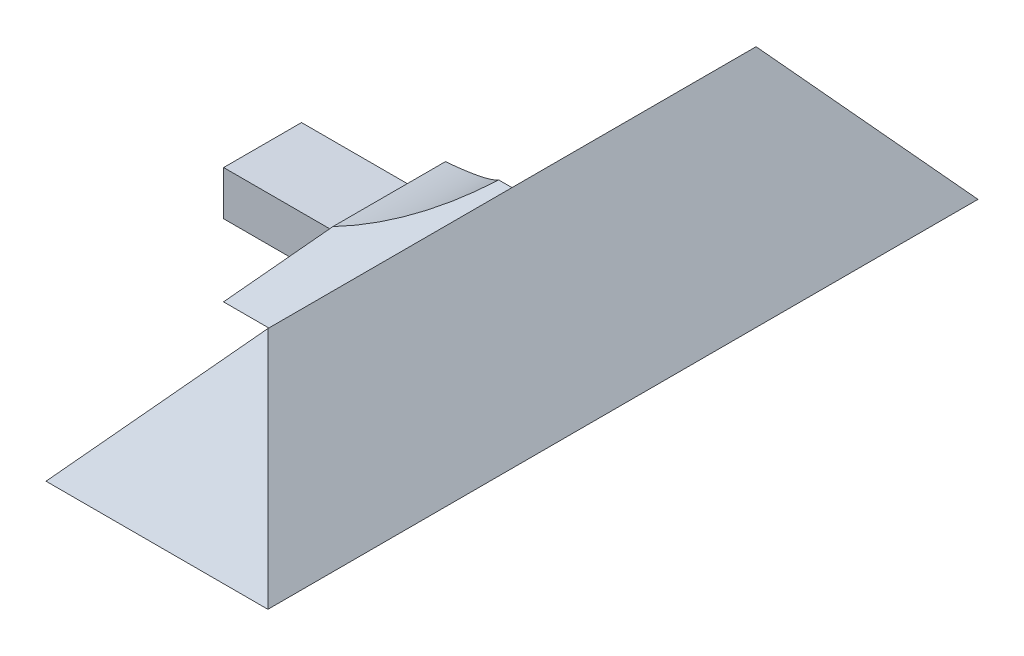
ISO-10303-21;
HEADER;
FILE_DESCRIPTION(('STEP AP214'),'2;1');
FILE_NAME('part.step','',(''),(''),'','','');
FILE_SCHEMA(('AUTOMOTIVE_DESIGN { 1 0 10303 214 1 1 1 1 }'));
ENDSEC;
DATA;
#1=APPLICATION_CONTEXT('core data for automotive mechanical design processes');
#2=APPLICATION_PROTOCOL_DEFINITION('international standard','automotive_design',2000,#1);
#3=PRODUCT_CONTEXT('',#1,'mechanical');
#4=PRODUCT('Part','Part','',(#3));
#5=PRODUCT_RELATED_PRODUCT_CATEGORY('part','',(#4));
#6=PRODUCT_DEFINITION_FORMATION('','',#4);
#7=PRODUCT_DEFINITION_CONTEXT('part definition',#1,'design');
#8=PRODUCT_DEFINITION('design','',#6,#7);
#9=PRODUCT_DEFINITION_SHAPE('','',#8);
#10=(LENGTH_UNIT() NAMED_UNIT(*) SI_UNIT(.MILLI.,.METRE.));
#11=(NAMED_UNIT(*) PLANE_ANGLE_UNIT() SI_UNIT($,.RADIAN.));
#12=(NAMED_UNIT(*) SI_UNIT($,.STERADIAN.) SOLID_ANGLE_UNIT());
#13=UNCERTAINTY_MEASURE_WITH_UNIT(LENGTH_MEASURE(1.E-05),#10,'distance_accuracy_value','');
#14=(GEOMETRIC_REPRESENTATION_CONTEXT(3) GLOBAL_UNCERTAINTY_ASSIGNED_CONTEXT((#13)) GLOBAL_UNIT_ASSIGNED_CONTEXT((#10,
#11,#12)) REPRESENTATION_CONTEXT('',''));
#15=CARTESIAN_POINT('',(0.,0.,0.));
#16=DIRECTION('',(0.,0.,1.));
#17=DIRECTION('',(1.,0.,0.));
#18=AXIS2_PLACEMENT_3D('',#15,#16,#17);
#19=CARTESIAN_POINT('',(0.,0.,0.));
#20=DIRECTION('',(-0.766044443118977,0.64278760968654,0.));
#21=DIRECTION('',(-0.64278760968654,-0.766044443118977,0.));
#22=AXIS2_PLACEMENT_3D('',#19,#20,#21);
#23=PLANE('',#22);
#24=DIRECTION('',(-0.540716203060937,-0.644400477571771,0.540716203060937));
#25=VECTOR('',#24,1.);
#26=CARTESIAN_POINT('',(0.,0.,0.));
#27=LINE('',#26,#25);
#28=CARTESIAN_POINT('',(12.3209791555007,14.6835711728463,-12.3209791555007));
#29=VERTEX_POINT('',#28);
#30=CARTESIAN_POINT('',(0.,0.,0.));
#31=VERTEX_POINT('',#30);
#32=EDGE_CURVE('E137',#29,#31,#27,.T.);
#33=ORIENTED_EDGE('',*,*,#32,.F.);
#34=DIRECTION('',(0.,0.,1.));
#35=VECTOR('',#34,1.);
#36=CARTESIAN_POINT('',(12.3209791555007,14.6835711728463,-80.));
#37=LINE('',#36,#35);
#38=CARTESIAN_POINT('',(12.3209791555007,14.6835711728463,-37.6790208444993));
#39=VERTEX_POINT('',#38);
#40=EDGE_CURVE('E126',#29,#39,#37,.F.);
#41=ORIENTED_EDGE('',*,*,#40,.T.);
#42=DIRECTION('',(-0.540716203060937,-0.644400477571771,-0.540716203060937));
#43=VECTOR('',#42,1.);
#44=CARTESIAN_POINT('',(14.6187006126319,17.4218889741631,-35.3812993873682));
#45=LINE('',#44,#43);
#46=CARTESIAN_POINT('',(0.,0.,-50.));
#47=VERTEX_POINT('',#46);
#48=EDGE_CURVE('E134',#39,#47,#45,.T.);
#49=ORIENTED_EDGE('',*,*,#48,.T.);
#50=DIRECTION('',(0.,0.,1.));
#51=VECTOR('',#50,1.);
#52=CARTESIAN_POINT('',(0.,0.,0.));
#53=LINE('',#52,#51);
#54=CARTESIAN_POINT('',(0.,0.,-33.7752249690268));
#55=VERTEX_POINT('',#54);
#56=EDGE_CURVE('E208',#47,#55,#53,.T.);
#57=ORIENTED_EDGE('',*,*,#56,.T.);
#58=DIRECTION('',(-0.64278760968654,-0.766044443118977,0.));
#59=VECTOR('',#58,1.);
#60=CARTESIAN_POINT('',(0.,0.,-33.7752249690268));
#61=LINE('',#60,#59);
#62=CARTESIAN_POINT('',(8.39099631177282,10.,-33.7752249690268));
#63=VERTEX_POINT('',#62);
#64=EDGE_CURVE('E219',#55,#63,#61,.F.);
#65=ORIENTED_EDGE('',*,*,#64,.T.);
#66=DIRECTION('',(0.,0.,1.));
#67=VECTOR('',#66,1.);
#68=CARTESIAN_POINT('',(8.39099631177282,10.,0.));
#69=LINE('',#68,#67);
#70=CARTESIAN_POINT('',(8.39099631177282,10.,-16.2247750309732));
#71=VERTEX_POINT('',#70);
#72=EDGE_CURVE('E11',#71,#63,#69,.F.);
#73=ORIENTED_EDGE('',*,*,#72,.F.);
#74=DIRECTION('',(0.64278760968654,0.766044443118977,0.));
#75=VECTOR('',#74,1.);
#76=CARTESIAN_POINT('',(0.,0.,-16.2247750309732));
#77=LINE('',#76,#75);
#78=CARTESIAN_POINT('',(0.,0.,-16.2247750309732));
#79=VERTEX_POINT('',#78);
#80=EDGE_CURVE('E242',#71,#79,#77,.F.);
#81=ORIENTED_EDGE('',*,*,#80,.T.);
#82=EDGE_CURVE('E213',#79,#31,#53,.T.);
#83=ORIENTED_EDGE('',*,*,#82,.T.);
#84=EDGE_LOOP('',(#33,#41,#49,#57,#65,#73,#81,#83));
#85=FACE_BOUND('',#84,.T.);
#86=ADVANCED_FACE('F41',(#85),#23,.T.);
#87=CARTESIAN_POINT('',(0.,0.,0.));
#88=DIRECTION('',(0.,0.64278760968654,0.766044443118977));
#89=DIRECTION('',(0.,-0.766044443118977,0.64278760968654));
#90=AXIS2_PLACEMENT_3D('',#87,#88,#89);
#91=PLANE('',#90);
#92=DIRECTION('',(1.,0.,0.));
#93=VECTOR('',#92,1.);
#94=CARTESIAN_POINT('',(0.,29.7938398148552,-25.));
#95=LINE('',#94,#93);
#96=CARTESIAN_POINT('',(36.9995878774412,29.7938398148552,-25.));
#97=VERTEX_POINT('',#96);
#98=CARTESIAN_POINT('',(40.,29.7938398148552,-25.));
#99=VERTEX_POINT('',#98);
#100=EDGE_CURVE('E50',#97,#99,#95,.T.);
#101=ORIENTED_EDGE('',*,*,#100,.F.);
#102=CARTESIAN_POINT('',(-13.7673292794252,85.,-71.323468650069));
#103=DIRECTION('',(0.,0.64278760968654,0.766044443118977));
#104=DIRECTION('',(0.,-0.766044443118977,0.64278760968654));
#105=AXIS2_PLACEMENT_3D('',#102,#103,#104);
#106=ELLIPSE('',#105,97.905546699921,75.);
#107=EDGE_CURVE('E57',#97,#29,#106,.F.);
#108=ORIENTED_EDGE('',*,*,#107,.T.);
#109=ORIENTED_EDGE('',*,*,#32,.T.);
#110=DIRECTION('',(1.,0.,0.));
#111=VECTOR('',#110,1.);
#112=CARTESIAN_POINT('',(0.,0.,0.));
#113=LINE('',#112,#111);
#114=CARTESIAN_POINT('',(15.,0.,0.));
#115=VERTEX_POINT('',#114);
#116=EDGE_CURVE('E197',#31,#115,#113,.T.);
#117=ORIENTED_EDGE('',*,*,#116,.T.);
#118=DIRECTION('',(-0.540716203060937,-0.644400477571771,0.540716203060937));
#119=VECTOR('',#118,1.);
#120=CARTESIAN_POINT('',(10.6143898162105,-5.22656669224895,4.38561018378957));
#121=LINE('',#120,#119);
#122=EDGE_CURVE('E169',#99,#115,#121,.T.);
#123=ORIENTED_EDGE('',*,*,#122,.F.);
#124=EDGE_LOOP('',(#101,#108,#109,#117,#123));
#125=FACE_BOUND('',#124,.T.);
#126=ADVANCED_FACE('F43',(#125),#91,.T.);
#127=CARTESIAN_POINT('',(15.,0.,0.));
#128=DIRECTION('',(-0.766044443118977,0.64278760968654,0.));
#129=DIRECTION('',(-0.64278760968654,-0.766044443118977,0.));
#130=AXIS2_PLACEMENT_3D('',#127,#128,#129);
#131=PLANE('',#130);
#132=DIRECTION('',(-0.540716203060937,-0.644400477571771,0.540716203060937));
#133=VECTOR('',#132,1.);
#134=CARTESIAN_POINT('',(29.6187006126319,17.4218889741631,40.3812993873682));
#135=LINE('',#134,#133);
#136=CARTESIAN_POINT('',(40.,29.7938398148552,30.));
#137=VERTEX_POINT('',#136);
#138=CARTESIAN_POINT('',(15.,0.,55.));
#139=VERTEX_POINT('',#138);
#140=EDGE_CURVE('E166',#137,#139,#135,.T.);
#141=ORIENTED_EDGE('',*,*,#140,.F.);
#142=DIRECTION('',(0.,0.,-1.));
#143=VECTOR('',#142,1.);
#144=CARTESIAN_POINT('',(40.,29.7938398148552,0.));
#145=LINE('',#144,#143);
#146=EDGE_CURVE('E172',#137,#99,#145,.T.);
#147=ORIENTED_EDGE('',*,*,#146,.T.);
#148=ORIENTED_EDGE('',*,*,#122,.T.);
#149=DIRECTION('',(0.,0.,1.));
#150=VECTOR('',#149,1.);
#151=CARTESIAN_POINT('',(15.,0.,0.));
#152=LINE('',#151,#150);
#153=EDGE_CURVE('E217',#115,#139,#152,.T.);
#154=ORIENTED_EDGE('',*,*,#153,.T.);
#155=EDGE_LOOP('',(#141,#147,#148,#154));
#156=FACE_BOUND('',#155,.T.);
#157=ADVANCED_FACE('F192',(#156),#131,.T.);
#158=CARTESIAN_POINT('',(65.,0.,55.));
#159=DIRECTION('',(0.,0.64278760968654,0.766044443118977));
#160=DIRECTION('',(0.,-0.766044443118977,0.64278760968654));
#161=AXIS2_PLACEMENT_3D('',#158,#159,#160);
#162=PLANE('',#161);
#163=DIRECTION('',(1.,0.,0.));
#164=VECTOR('',#163,1.);
#165=CARTESIAN_POINT('',(65.,0.,55.));
#166=LINE('',#165,#164);
#167=CARTESIAN_POINT('',(65.,0.,55.));
#168=VERTEX_POINT('',#167);
#169=EDGE_CURVE('E225',#139,#168,#166,.T.);
#170=ORIENTED_EDGE('',*,*,#169,.T.);
#171=DIRECTION('',(0.540716203060938,-0.644400477571771,0.540716203060937));
#172=VECTOR('',#171,1.);
#173=CARTESIAN_POINT('',(18.2201580395781,55.750044717322,8.2201580395781));
#174=LINE('',#173,#172);
#175=EDGE_CURVE('E162',#137,#168,#174,.T.);
#176=ORIENTED_EDGE('',*,*,#175,.F.);
#177=ORIENTED_EDGE('',*,*,#140,.T.);
#178=EDGE_LOOP('',(#170,#176,#177));
#179=FACE_BOUND('',#178,.T.);
#180=ADVANCED_FACE('F237',(#179),#162,.T.);
#181=CARTESIAN_POINT('',(65.,0.,-105.));
#182=DIRECTION('',(0.766044443118977,0.64278760968654,0.));
#183=DIRECTION('',(-0.64278760968654,0.766044443118977,0.));
#184=AXIS2_PLACEMENT_3D('',#181,#182,#183);
#185=PLANE('',#184);
#186=DIRECTION('',(0.540716203060937,-0.644400477571771,-0.540716203060937));
#187=VECTOR('',#186,1.);
#188=CARTESIAN_POINT('',(65.,0.,-105.));
#189=LINE('',#188,#187);
#190=CARTESIAN_POINT('',(40.,29.7938398148552,-80.));
#191=VERTEX_POINT('',#190);
#192=CARTESIAN_POINT('',(65.,0.,-105.));
#193=VERTEX_POINT('',#192);
#194=EDGE_CURVE('E159',#191,#193,#189,.T.);
#195=ORIENTED_EDGE('',*,*,#194,.F.);
#196=DIRECTION('',(0.,0.,1.));
#197=VECTOR('',#196,1.);
#198=CARTESIAN_POINT('',(40.,29.7938398148552,-105.));
#199=LINE('',#198,#197);
#200=EDGE_CURVE('E176',#191,#99,#199,.T.);
#201=ORIENTED_EDGE('',*,*,#200,.T.);
#202=ORIENTED_EDGE('',*,*,#146,.F.);
#203=ORIENTED_EDGE('',*,*,#175,.T.);
#204=DIRECTION('',(0.,0.,-1.));
#205=VECTOR('',#204,1.);
#206=CARTESIAN_POINT('',(65.,0.,-105.));
#207=LINE('',#206,#205);
#208=EDGE_CURVE('E228',#168,#193,#207,.T.);
#209=ORIENTED_EDGE('',*,*,#208,.T.);
#210=EDGE_LOOP('',(#195,#201,#202,#203,#209));
#211=FACE_BOUND('',#210,.T.);
#212=ADVANCED_FACE('F186',(#211),#185,.T.);
#213=CARTESIAN_POINT('',(65.,0.,-105.));
#214=DIRECTION('',(0.,0.64278760968654,-0.766044443118977));
#215=DIRECTION('',(0.,0.766044443118977,0.64278760968654));
#216=AXIS2_PLACEMENT_3D('',#213,#214,#215);
#217=PLANE('',#216);
#218=DIRECTION('',(-1.,0.,0.));
#219=VECTOR('',#218,1.);
#220=CARTESIAN_POINT('',(65.,0.,-105.));
#221=LINE('',#220,#219);
#222=CARTESIAN_POINT('',(15.,0.,-105.));
#223=VERTEX_POINT('',#222);
#224=EDGE_CURVE('E204',#193,#223,#221,.T.);
#225=ORIENTED_EDGE('',*,*,#224,.T.);
#226=DIRECTION('',(-0.540716203060937,-0.644400477571771,-0.540716203060937));
#227=VECTOR('',#226,1.);
#228=CARTESIAN_POINT('',(15.,0.,-105.));
#229=LINE('',#228,#227);
#230=EDGE_CURVE('E150',#191,#223,#229,.T.);
#231=ORIENTED_EDGE('',*,*,#230,.F.);
#232=ORIENTED_EDGE('',*,*,#194,.T.);
#233=EDGE_LOOP('',(#225,#231,#232));
#234=FACE_BOUND('',#233,.T.);
#235=ADVANCED_FACE('F233',(#234),#217,.T.);
#236=CARTESIAN_POINT('',(15.,0.,-105.));
#237=DIRECTION('',(-0.766044443118977,0.64278760968654,0.));
#238=DIRECTION('',(-0.64278760968654,-0.766044443118977,0.));
#239=AXIS2_PLACEMENT_3D('',#236,#237,#238);
#240=PLANE('',#239);
#241=ORIENTED_EDGE('',*,*,#200,.F.);
#242=ORIENTED_EDGE('',*,*,#230,.T.);
#243=DIRECTION('',(0.,0.,1.));
#244=VECTOR('',#243,1.);
#245=CARTESIAN_POINT('',(15.,0.,-105.));
#246=LINE('',#245,#244);
#247=CARTESIAN_POINT('',(15.,0.,-50.));
#248=VERTEX_POINT('',#247);
#249=EDGE_CURVE('E152',#223,#248,#246,.T.);
#250=ORIENTED_EDGE('',*,*,#249,.T.);
#251=DIRECTION('',(-0.540716203060937,-0.644400477571771,-0.540716203060937));
#252=VECTOR('',#251,1.);
#253=CARTESIAN_POINT('',(-1.08057067389501,-19.1640778715794,-66.080570673895));
#254=LINE('',#253,#252);
#255=EDGE_CURVE('E146',#99,#248,#254,.T.);
#256=ORIENTED_EDGE('',*,*,#255,.F.);
#257=EDGE_LOOP('',(#241,#242,#250,#256));
#258=FACE_BOUND('',#257,.T.);
#259=ADVANCED_FACE('F199',(#258),#240,.T.);
#260=CARTESIAN_POINT('',(0.,0.,-50.));
#261=DIRECTION('',(0.,0.64278760968654,-0.766044443118977));
#262=DIRECTION('',(0.,0.766044443118977,0.64278760968654));
#263=AXIS2_PLACEMENT_3D('',#260,#261,#262);
#264=PLANE('',#263);
#265=ORIENTED_EDGE('',*,*,#48,.F.);
#266=CARTESIAN_POINT('',(-13.7673292794252,85.,21.323468650069));
#267=DIRECTION('',(0.,0.64278760968654,-0.766044443118977));
#268=DIRECTION('',(0.,0.766044443118977,0.64278760968654));
#269=AXIS2_PLACEMENT_3D('',#266,#267,#268);
#270=ELLIPSE('',#269,97.905546699921,75.);
#271=EDGE_CURVE('E123',#39,#97,#270,.F.);
#272=ORIENTED_EDGE('',*,*,#271,.T.);
#273=ORIENTED_EDGE('',*,*,#100,.T.);
#274=ORIENTED_EDGE('',*,*,#255,.T.);
#275=DIRECTION('',(-1.,0.,0.));
#276=VECTOR('',#275,1.);
#277=CARTESIAN_POINT('',(0.,0.,-50.));
#278=LINE('',#277,#276);
#279=EDGE_CURVE('E143',#248,#47,#278,.T.);
#280=ORIENTED_EDGE('',*,*,#279,.T.);
#281=EDGE_LOOP('',(#265,#272,#273,#274,#280));
#282=FACE_BOUND('',#281,.T.);
#283=ADVANCED_FACE('F141',(#282),#264,.T.);
#284=CARTESIAN_POINT('',(0.,0.,0.));
#285=DIRECTION('',(0.,-1.,0.));
#286=DIRECTION('',(0.,0.,-1.));
#287=AXIS2_PLACEMENT_3D('',#284,#285,#286);
#288=PLANE('',#287);
#289=ORIENTED_EDGE('',*,*,#82,.F.);
#290=DIRECTION('',(-1.,0.,0.));
#291=VECTOR('',#290,1.);
#292=CARTESIAN_POINT('',(-16.2004153274341,0.,-16.2247750309732));
#293=LINE('',#292,#291);
#294=CARTESIAN_POINT('',(-16.2004153274341,0.,-16.2247750309732));
#295=VERTEX_POINT('',#294);
#296=EDGE_CURVE('E139',#79,#295,#293,.T.);
#297=ORIENTED_EDGE('',*,*,#296,.T.);
#298=DIRECTION('',(0.,0.,-1.));
#299=VECTOR('',#298,1.);
#300=CARTESIAN_POINT('',(-16.2004153274341,0.,-16.2247750309732));
#301=LINE('',#300,#299);
#302=CARTESIAN_POINT('',(-16.2004153274341,0.,-33.7752249690268));
#303=VERTEX_POINT('',#302);
#304=EDGE_CURVE('E252',#295,#303,#301,.T.);
#305=ORIENTED_EDGE('',*,*,#304,.T.);
#306=DIRECTION('',(1.,0.,0.));
#307=VECTOR('',#306,1.);
#308=CARTESIAN_POINT('',(-16.2004153274341,0.,-33.7752249690268));
#309=LINE('',#308,#307);
#310=EDGE_CURVE('E211',#303,#55,#309,.T.);
#311=ORIENTED_EDGE('',*,*,#310,.T.);
#312=ORIENTED_EDGE('',*,*,#56,.F.);
#313=ORIENTED_EDGE('',*,*,#279,.F.);
#314=ORIENTED_EDGE('',*,*,#249,.F.);
#315=ORIENTED_EDGE('',*,*,#224,.F.);
#316=ORIENTED_EDGE('',*,*,#208,.F.);
#317=ORIENTED_EDGE('',*,*,#169,.F.);
#318=ORIENTED_EDGE('',*,*,#153,.F.);
#319=ORIENTED_EDGE('',*,*,#116,.F.);
#320=EDGE_LOOP('',(#289,#297,#305,#311,#312,#313,#314,#315,#316,#317,#318,#319));
#321=FACE_BOUND('',#320,.T.);
#322=ADVANCED_FACE('F206',(#321),#288,.T.);
#323=CARTESIAN_POINT('',(0.,10.,0.));
#324=DIRECTION('',(0.,-1.,0.));
#325=DIRECTION('',(0.,0.,-1.));
#326=AXIS2_PLACEMENT_3D('',#323,#324,#325);
#327=PLANE('',#326);
#328=ORIENTED_EDGE('',*,*,#72,.T.);
#329=DIRECTION('',(1.,0.,0.));
#330=VECTOR('',#329,1.);
#331=CARTESIAN_POINT('',(-16.2004153274341,10.,-33.7752249690268));
#332=LINE('',#331,#330);
#333=CARTESIAN_POINT('',(-16.2004153274341,10.,-33.7752249690268));
#334=VERTEX_POINT('',#333);
#335=EDGE_CURVE('E65',#334,#63,#332,.T.);
#336=ORIENTED_EDGE('',*,*,#335,.F.);
#337=DIRECTION('',(0.,0.,-1.));
#338=VECTOR('',#337,1.);
#339=CARTESIAN_POINT('',(-16.2004153274341,10.,-16.2247750309732));
#340=LINE('',#339,#338);
#341=CARTESIAN_POINT('',(-16.2004153274341,10.,-16.2247750309732));
#342=VERTEX_POINT('',#341);
#343=EDGE_CURVE('E266',#342,#334,#340,.T.);
#344=ORIENTED_EDGE('',*,*,#343,.F.);
#345=DIRECTION('',(-1.,0.,0.));
#346=VECTOR('',#345,1.);
#347=CARTESIAN_POINT('',(-16.2004153274341,10.,-16.2247750309732));
#348=LINE('',#347,#346);
#349=EDGE_CURVE('E261',#71,#342,#348,.T.);
#350=ORIENTED_EDGE('',*,*,#349,.F.);
#351=EDGE_LOOP('',(#328,#336,#344,#350));
#352=FACE_BOUND('',#351,.T.);
#353=ADVANCED_FACE('F278',(#352),#327,.F.);
#354=CARTESIAN_POINT('',(-16.2004153274341,10.,-33.7752249690268));
#355=DIRECTION('',(0.,0.,-1.));
#356=DIRECTION('',(-1.,0.,0.));
#357=AXIS2_PLACEMENT_3D('',#354,#355,#356);
#358=PLANE('',#357);
#359=ORIENTED_EDGE('',*,*,#64,.F.);
#360=ORIENTED_EDGE('',*,*,#310,.F.);
#361=DIRECTION('',(0.,-1.,0.));
#362=VECTOR('',#361,1.);
#363=CARTESIAN_POINT('',(-16.2004153274341,10.,-33.7752249690268));
#364=LINE('',#363,#362);
#365=EDGE_CURVE('E246',#334,#303,#364,.T.);
#366=ORIENTED_EDGE('',*,*,#365,.F.);
#367=ORIENTED_EDGE('',*,*,#335,.T.);
#368=EDGE_LOOP('',(#359,#360,#366,#367));
#369=FACE_BOUND('',#368,.T.);
#370=ADVANCED_FACE('F280',(#369),#358,.T.);
#371=CARTESIAN_POINT('',(-16.2004153274341,10.,-16.2247750309732));
#372=DIRECTION('',(0.,0.,1.));
#373=DIRECTION('',(1.,0.,0.));
#374=AXIS2_PLACEMENT_3D('',#371,#372,#373);
#375=PLANE('',#374);
#376=ORIENTED_EDGE('',*,*,#80,.F.);
#377=ORIENTED_EDGE('',*,*,#349,.T.);
#378=DIRECTION('',(0.,-1.,0.));
#379=VECTOR('',#378,1.);
#380=CARTESIAN_POINT('',(-16.2004153274341,10.,-16.2247750309732));
#381=LINE('',#380,#379);
#382=EDGE_CURVE('E249',#342,#295,#381,.T.);
#383=ORIENTED_EDGE('',*,*,#382,.T.);
#384=ORIENTED_EDGE('',*,*,#296,.F.);
#385=EDGE_LOOP('',(#376,#377,#383,#384));
#386=FACE_BOUND('',#385,.T.);
#387=ADVANCED_FACE('F247',(#386),#375,.T.);
#388=CARTESIAN_POINT('',(-16.2004153274341,10.,-16.2247750309732));
#389=DIRECTION('',(-1.,0.,0.));
#390=DIRECTION('',(0.,0.,1.));
#391=AXIS2_PLACEMENT_3D('',#388,#389,#390);
#392=PLANE('',#391);
#393=ORIENTED_EDGE('',*,*,#304,.F.);
#394=ORIENTED_EDGE('',*,*,#382,.F.);
#395=ORIENTED_EDGE('',*,*,#343,.T.);
#396=ORIENTED_EDGE('',*,*,#365,.T.);
#397=EDGE_LOOP('',(#393,#394,#395,#396));
#398=FACE_BOUND('',#397,.T.);
#399=ADVANCED_FACE('F277',(#398),#392,.T.);
#400=CARTESIAN_POINT('',(-13.7673292794252,85.,-80.));
#401=DIRECTION('',(0.,0.,1.));
#402=DIRECTION('',(1.,0.,0.));
#403=AXIS2_PLACEMENT_3D('',#400,#401,#402);
#404=CYLINDRICAL_SURFACE('',#403,75.);
#405=ORIENTED_EDGE('',*,*,#107,.F.);
#406=ORIENTED_EDGE('',*,*,#271,.F.);
#407=ORIENTED_EDGE('',*,*,#40,.F.);
#408=EDGE_LOOP('',(#405,#406,#407));
#409=FACE_BOUND('',#408,.T.);
#410=ADVANCED_FACE('F125',(#409),#404,.F.);
#411=CLOSED_SHELL('',(#86,#126,#157,#180,#212,#235,#259,#283,#322,#353,#370,#387,#399,#410));
#412=MANIFOLD_SOLID_BREP('B2',#411);
#413=ADVANCED_BREP_SHAPE_REPRESENTATION('',(#18,#412),#14);
#414=SHAPE_DEFINITION_REPRESENTATION(#9,#413);
ENDSEC;
END-ISO-10303-21;
